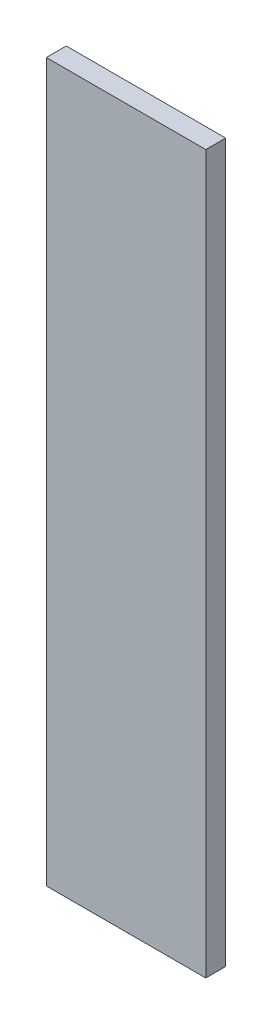
ISO-10303-21;
HEADER;
FILE_DESCRIPTION(('STEP AP214'),'2;1');
FILE_NAME('part.step','',(''),(''),'','','');
FILE_SCHEMA(('AUTOMOTIVE_DESIGN { 1 0 10303 214 1 1 1 1 }'));
ENDSEC;
DATA;
#1=APPLICATION_CONTEXT('core data for automotive mechanical design processes');
#2=APPLICATION_PROTOCOL_DEFINITION('international standard','automotive_design',2000,#1);
#3=PRODUCT_CONTEXT('',#1,'mechanical');
#4=PRODUCT('Part','Part','',(#3));
#5=PRODUCT_RELATED_PRODUCT_CATEGORY('part','',(#4));
#6=PRODUCT_DEFINITION_FORMATION('','',#4);
#7=PRODUCT_DEFINITION_CONTEXT('part definition',#1,'design');
#8=PRODUCT_DEFINITION('design','',#6,#7);
#9=PRODUCT_DEFINITION_SHAPE('','',#8);
#10=(LENGTH_UNIT() NAMED_UNIT(*) SI_UNIT(.MILLI.,.METRE.));
#11=(NAMED_UNIT(*) PLANE_ANGLE_UNIT() SI_UNIT($,.RADIAN.));
#12=(NAMED_UNIT(*) SI_UNIT($,.STERADIAN.) SOLID_ANGLE_UNIT());
#13=UNCERTAINTY_MEASURE_WITH_UNIT(LENGTH_MEASURE(1.E-05),#10,'distance_accuracy_value','');
#14=(GEOMETRIC_REPRESENTATION_CONTEXT(3) GLOBAL_UNCERTAINTY_ASSIGNED_CONTEXT((#13)) GLOBAL_UNIT_ASSIGNED_CONTEXT((#10,
#11,#12)) REPRESENTATION_CONTEXT('',''));
#15=CARTESIAN_POINT('',(0.,0.,0.));
#16=DIRECTION('',(0.,0.,1.));
#17=DIRECTION('',(1.,0.,0.));
#18=AXIS2_PLACEMENT_3D('',#15,#16,#17);
#19=CARTESIAN_POINT('',(40.,-180.,10.));
#20=DIRECTION('',(-1.,0.,0.));
#21=DIRECTION('',(0.,0.,1.));
#22=AXIS2_PLACEMENT_3D('',#19,#20,#21);
#23=PLANE('',#22);
#24=DIRECTION('',(0.,1.,0.));
#25=VECTOR('',#24,1.);
#26=CARTESIAN_POINT('',(40.,-180.,0.));
#27=LINE('',#26,#25);
#28=CARTESIAN_POINT('',(40.,-180.,0.));
#29=VERTEX_POINT('',#28);
#30=CARTESIAN_POINT('',(40.,180.,0.));
#31=VERTEX_POINT('',#30);
#32=EDGE_CURVE('E96',#29,#31,#27,.T.);
#33=ORIENTED_EDGE('',*,*,#32,.T.);
#34=DIRECTION('',(0.,0.,-1.));
#35=VECTOR('',#34,1.);
#36=CARTESIAN_POINT('',(40.,180.,10.));
#37=LINE('',#36,#35);
#38=CARTESIAN_POINT('',(40.,180.,10.));
#39=VERTEX_POINT('',#38);
#40=EDGE_CURVE('E11',#39,#31,#37,.T.);
#41=ORIENTED_EDGE('',*,*,#40,.F.);
#42=DIRECTION('',(0.,1.,0.));
#43=VECTOR('',#42,1.);
#44=CARTESIAN_POINT('',(40.,-180.,10.));
#45=LINE('',#44,#43);
#46=CARTESIAN_POINT('',(40.,-180.,10.));
#47=VERTEX_POINT('',#46);
#48=EDGE_CURVE('E84',#47,#39,#45,.T.);
#49=ORIENTED_EDGE('',*,*,#48,.F.);
#50=DIRECTION('',(0.,0.,-1.));
#51=VECTOR('',#50,1.);
#52=CARTESIAN_POINT('',(40.,-180.,10.));
#53=LINE('',#52,#51);
#54=EDGE_CURVE('E92',#47,#29,#53,.T.);
#55=ORIENTED_EDGE('',*,*,#54,.T.);
#56=EDGE_LOOP('',(#33,#41,#49,#55));
#57=FACE_BOUND('',#56,.T.);
#58=ADVANCED_FACE('F33',(#57),#23,.F.);
#59=CARTESIAN_POINT('',(-40.,180.,10.));
#60=DIRECTION('',(0.,-1.,0.));
#61=DIRECTION('',(0.,0.,-1.));
#62=AXIS2_PLACEMENT_3D('',#59,#60,#61);
#63=PLANE('',#62);
#64=DIRECTION('',(-1.,0.,0.));
#65=VECTOR('',#64,1.);
#66=CARTESIAN_POINT('',(-40.,180.,0.));
#67=LINE('',#66,#65);
#68=CARTESIAN_POINT('',(-40.,180.,0.));
#69=VERTEX_POINT('',#68);
#70=EDGE_CURVE('E88',#31,#69,#67,.T.);
#71=ORIENTED_EDGE('',*,*,#70,.T.);
#72=DIRECTION('',(0.,0.,-1.));
#73=VECTOR('',#72,1.);
#74=CARTESIAN_POINT('',(-40.,180.,10.));
#75=LINE('',#74,#73);
#76=CARTESIAN_POINT('',(-40.,180.,10.));
#77=VERTEX_POINT('',#76);
#78=EDGE_CURVE('E41',#77,#69,#75,.T.);
#79=ORIENTED_EDGE('',*,*,#78,.F.);
#80=DIRECTION('',(-1.,0.,0.));
#81=VECTOR('',#80,1.);
#82=CARTESIAN_POINT('',(-40.,180.,10.));
#83=LINE('',#82,#81);
#84=EDGE_CURVE('E79',#39,#77,#83,.T.);
#85=ORIENTED_EDGE('',*,*,#84,.F.);
#86=ORIENTED_EDGE('',*,*,#40,.T.);
#87=EDGE_LOOP('',(#71,#79,#85,#86));
#88=FACE_BOUND('',#87,.T.);
#89=ADVANCED_FACE('F87',(#88),#63,.F.);
#90=CARTESIAN_POINT('',(-40.,-180.,10.));
#91=DIRECTION('',(1.,0.,0.));
#92=DIRECTION('',(0.,0.,-1.));
#93=AXIS2_PLACEMENT_3D('',#90,#91,#92);
#94=PLANE('',#93);
#95=DIRECTION('',(0.,-1.,0.));
#96=VECTOR('',#95,1.);
#97=CARTESIAN_POINT('',(-40.,-180.,0.));
#98=LINE('',#97,#96);
#99=CARTESIAN_POINT('',(-40.,-180.,0.));
#100=VERTEX_POINT('',#99);
#101=EDGE_CURVE('E66',#69,#100,#98,.T.);
#102=ORIENTED_EDGE('',*,*,#101,.T.);
#103=DIRECTION('',(0.,0.,-1.));
#104=VECTOR('',#103,1.);
#105=CARTESIAN_POINT('',(-40.,-180.,10.));
#106=LINE('',#105,#104);
#107=CARTESIAN_POINT('',(-40.,-180.,10.));
#108=VERTEX_POINT('',#107);
#109=EDGE_CURVE('E89',#108,#100,#106,.T.);
#110=ORIENTED_EDGE('',*,*,#109,.F.);
#111=DIRECTION('',(0.,-1.,0.));
#112=VECTOR('',#111,1.);
#113=CARTESIAN_POINT('',(-40.,-180.,10.));
#114=LINE('',#113,#112);
#115=EDGE_CURVE('E82',#77,#108,#114,.T.);
#116=ORIENTED_EDGE('',*,*,#115,.F.);
#117=ORIENTED_EDGE('',*,*,#78,.T.);
#118=EDGE_LOOP('',(#102,#110,#116,#117));
#119=FACE_BOUND('',#118,.T.);
#120=ADVANCED_FACE('F90',(#119),#94,.F.);
#121=CARTESIAN_POINT('',(-40.,-180.,10.));
#122=DIRECTION('',(0.,1.,0.));
#123=DIRECTION('',(0.,0.,1.));
#124=AXIS2_PLACEMENT_3D('',#121,#122,#123);
#125=PLANE('',#124);
#126=DIRECTION('',(1.,0.,0.));
#127=VECTOR('',#126,1.);
#128=CARTESIAN_POINT('',(-40.,-180.,0.));
#129=LINE('',#128,#127);
#130=EDGE_CURVE('E72',#100,#29,#129,.T.);
#131=ORIENTED_EDGE('',*,*,#130,.T.);
#132=ORIENTED_EDGE('',*,*,#54,.F.);
#133=DIRECTION('',(1.,0.,0.));
#134=VECTOR('',#133,1.);
#135=CARTESIAN_POINT('',(-40.,-180.,10.));
#136=LINE('',#135,#134);
#137=EDGE_CURVE('E49',#108,#47,#136,.T.);
#138=ORIENTED_EDGE('',*,*,#137,.F.);
#139=ORIENTED_EDGE('',*,*,#109,.T.);
#140=EDGE_LOOP('',(#131,#132,#138,#139));
#141=FACE_BOUND('',#140,.T.);
#142=ADVANCED_FACE('F103',(#141),#125,.F.);
#143=CARTESIAN_POINT('',(0.,0.,10.));
#144=DIRECTION('',(0.,0.,-1.));
#145=DIRECTION('',(-1.,0.,0.));
#146=AXIS2_PLACEMENT_3D('',#143,#144,#145);
#147=PLANE('',#146);
#148=ORIENTED_EDGE('',*,*,#48,.T.);
#149=ORIENTED_EDGE('',*,*,#84,.T.);
#150=ORIENTED_EDGE('',*,*,#115,.T.);
#151=ORIENTED_EDGE('',*,*,#137,.T.);
#152=EDGE_LOOP('',(#148,#149,#150,#151));
#153=FACE_BOUND('',#152,.T.);
#154=ADVANCED_FACE('F80',(#153),#147,.F.);
#155=CARTESIAN_POINT('',(0.,0.,0.));
#156=DIRECTION('',(0.,0.,-1.));
#157=DIRECTION('',(-1.,0.,0.));
#158=AXIS2_PLACEMENT_3D('',#155,#156,#157);
#159=PLANE('',#158);
#160=ORIENTED_EDGE('',*,*,#32,.F.);
#161=ORIENTED_EDGE('',*,*,#130,.F.);
#162=ORIENTED_EDGE('',*,*,#101,.F.);
#163=ORIENTED_EDGE('',*,*,#70,.F.);
#164=EDGE_LOOP('',(#160,#161,#162,#163));
#165=FACE_BOUND('',#164,.T.);
#166=ADVANCED_FACE('F106',(#165),#159,.T.);
#167=CLOSED_SHELL('',(#58,#89,#120,#142,#154,#166));
#168=MANIFOLD_SOLID_BREP('B2',#167);
#169=ADVANCED_BREP_SHAPE_REPRESENTATION('',(#18,#168),#14);
#170=SHAPE_DEFINITION_REPRESENTATION(#9,#169);
ENDSEC;
END-ISO-10303-21;
